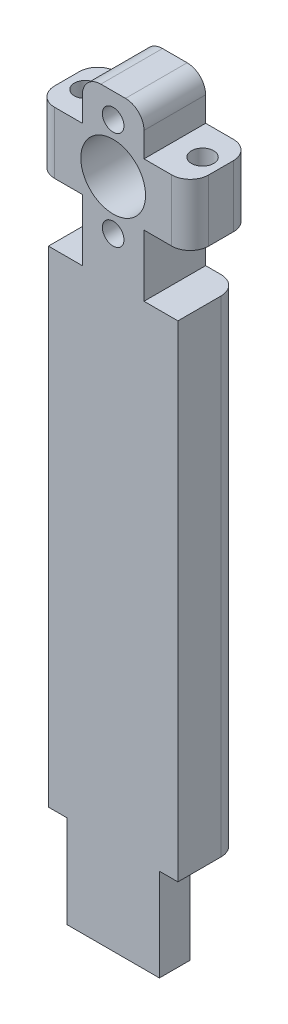
ISO-10303-21;
HEADER;
FILE_DESCRIPTION(('STEP AP214'),'2;1');
FILE_NAME('part.step','',(''),(''),'','','');
FILE_SCHEMA(('AUTOMOTIVE_DESIGN { 1 0 10303 214 1 1 1 1 }'));
ENDSEC;
DATA;
#1=APPLICATION_CONTEXT('core data for automotive mechanical design processes');
#2=APPLICATION_PROTOCOL_DEFINITION('international standard','automotive_design',2000,#1);
#3=PRODUCT_CONTEXT('',#1,'mechanical');
#4=PRODUCT('Part','Part','',(#3));
#5=PRODUCT_RELATED_PRODUCT_CATEGORY('part','',(#4));
#6=PRODUCT_DEFINITION_FORMATION('','',#4);
#7=PRODUCT_DEFINITION_CONTEXT('part definition',#1,'design');
#8=PRODUCT_DEFINITION('design','',#6,#7);
#9=PRODUCT_DEFINITION_SHAPE('','',#8);
#10=(LENGTH_UNIT() NAMED_UNIT(*) SI_UNIT(.MILLI.,.METRE.));
#11=(NAMED_UNIT(*) PLANE_ANGLE_UNIT() SI_UNIT($,.RADIAN.));
#12=(NAMED_UNIT(*) SI_UNIT($,.STERADIAN.) SOLID_ANGLE_UNIT());
#13=UNCERTAINTY_MEASURE_WITH_UNIT(LENGTH_MEASURE(1.E-05),#10,'distance_accuracy_value','');
#14=(GEOMETRIC_REPRESENTATION_CONTEXT(3) GLOBAL_UNCERTAINTY_ASSIGNED_CONTEXT((#13)) GLOBAL_UNIT_ASSIGNED_CONTEXT((#10,
#11,#12)) REPRESENTATION_CONTEXT('',''));
#15=CARTESIAN_POINT('',(0.,0.,0.));
#16=DIRECTION('',(0.,0.,1.));
#17=DIRECTION('',(1.,0.,0.));
#18=AXIS2_PLACEMENT_3D('',#15,#16,#17);
#19=CARTESIAN_POINT('',(-7.5,-108.8,0.));
#20=DIRECTION('',(1.,0.,0.));
#21=DIRECTION('',(0.,0.,-1.));
#22=AXIS2_PLACEMENT_3D('',#19,#20,#21);
#23=PLANE('',#22);
#24=DIRECTION('',(0.,1.,0.));
#25=VECTOR('',#24,1.);
#26=CARTESIAN_POINT('',(-7.5,-108.8,5.));
#27=LINE('',#26,#25);
#28=CARTESIAN_POINT('',(-7.5,-108.8,5.));
#29=VERTEX_POINT('',#28);
#30=CARTESIAN_POINT('',(-7.5,-93.8,5.));
#31=VERTEX_POINT('',#30);
#32=EDGE_CURVE('E225',#29,#31,#27,.T.);
#33=ORIENTED_EDGE('',*,*,#32,.F.);
#34=DIRECTION('',(0.,0.,-1.));
#35=VECTOR('',#34,1.);
#36=CARTESIAN_POINT('',(-7.5,-108.8,0.));
#37=LINE('',#36,#35);
#38=CARTESIAN_POINT('',(-7.5,-108.8,10.));
#39=VERTEX_POINT('',#38);
#40=EDGE_CURVE('E237',#39,#29,#37,.T.);
#41=ORIENTED_EDGE('',*,*,#40,.F.);
#42=DIRECTION('',(0.,1.,0.));
#43=VECTOR('',#42,1.);
#44=CARTESIAN_POINT('',(-7.5,-108.8,10.));
#45=LINE('',#44,#43);
#46=CARTESIAN_POINT('',(-7.5,-93.8,10.));
#47=VERTEX_POINT('',#46);
#48=EDGE_CURVE('E257',#39,#47,#45,.T.);
#49=ORIENTED_EDGE('',*,*,#48,.T.);
#50=DIRECTION('',(0.,0.,-1.));
#51=VECTOR('',#50,1.);
#52=CARTESIAN_POINT('',(-7.5,-93.8,0.));
#53=LINE('',#52,#51);
#54=EDGE_CURVE('E239',#47,#31,#53,.T.);
#55=ORIENTED_EDGE('',*,*,#54,.T.);
#56=EDGE_LOOP('',(#33,#41,#49,#55));
#57=FACE_BOUND('',#56,.T.);
#58=ADVANCED_FACE('F37',(#57),#23,.F.);
#59=CARTESIAN_POINT('',(7.5,-108.8,0.));
#60=DIRECTION('',(-1.,0.,0.));
#61=DIRECTION('',(0.,0.,1.));
#62=AXIS2_PLACEMENT_3D('',#59,#60,#61);
#63=PLANE('',#62);
#64=DIRECTION('',(0.,-1.,0.));
#65=VECTOR('',#64,1.);
#66=CARTESIAN_POINT('',(7.5,-93.8,5.));
#67=LINE('',#66,#65);
#68=CARTESIAN_POINT('',(7.5,-93.8,5.));
#69=VERTEX_POINT('',#68);
#70=CARTESIAN_POINT('',(7.5,-108.8,5.));
#71=VERTEX_POINT('',#70);
#72=EDGE_CURVE('E228',#69,#71,#67,.T.);
#73=ORIENTED_EDGE('',*,*,#72,.F.);
#74=DIRECTION('',(0.,0.,1.));
#75=VECTOR('',#74,1.);
#76=CARTESIAN_POINT('',(7.5,-93.8,0.));
#77=LINE('',#76,#75);
#78=CARTESIAN_POINT('',(7.5,-93.8,10.));
#79=VERTEX_POINT('',#78);
#80=EDGE_CURVE('E404',#69,#79,#77,.T.);
#81=ORIENTED_EDGE('',*,*,#80,.T.);
#82=DIRECTION('',(0.,1.,0.));
#83=VECTOR('',#82,1.);
#84=CARTESIAN_POINT('',(7.5,-108.8,10.));
#85=LINE('',#84,#83);
#86=CARTESIAN_POINT('',(7.5,-108.8,10.));
#87=VERTEX_POINT('',#86);
#88=EDGE_CURVE('E262',#87,#79,#85,.T.);
#89=ORIENTED_EDGE('',*,*,#88,.F.);
#90=DIRECTION('',(0.,0.,1.));
#91=VECTOR('',#90,1.);
#92=CARTESIAN_POINT('',(7.5,-108.8,0.));
#93=LINE('',#92,#91);
#94=EDGE_CURVE('E246',#71,#87,#93,.T.);
#95=ORIENTED_EDGE('',*,*,#94,.F.);
#96=EDGE_LOOP('',(#73,#81,#89,#95));
#97=FACE_BOUND('',#96,.T.);
#98=ADVANCED_FACE('F523',(#97),#63,.F.);
#99=CARTESIAN_POINT('',(0.,-108.8,0.));
#100=DIRECTION('',(0.,1.,0.));
#101=DIRECTION('',(0.,0.,1.));
#102=AXIS2_PLACEMENT_3D('',#99,#100,#101);
#103=PLANE('',#102);
#104=DIRECTION('',(-1.,0.,0.));
#105=VECTOR('',#104,1.);
#106=CARTESIAN_POINT('',(7.5,-108.8,5.));
#107=LINE('',#106,#105);
#108=EDGE_CURVE('E222',#71,#29,#107,.T.);
#109=ORIENTED_EDGE('',*,*,#108,.F.);
#110=ORIENTED_EDGE('',*,*,#94,.T.);
#111=DIRECTION('',(-1.,0.,0.));
#112=VECTOR('',#111,1.);
#113=CARTESIAN_POINT('',(-7.5,-108.8,10.));
#114=LINE('',#113,#112);
#115=EDGE_CURVE('E244',#87,#39,#114,.T.);
#116=ORIENTED_EDGE('',*,*,#115,.T.);
#117=ORIENTED_EDGE('',*,*,#40,.T.);
#118=EDGE_LOOP('',(#109,#110,#116,#117));
#119=FACE_BOUND('',#118,.T.);
#120=ADVANCED_FACE('F242',(#119),#103,.F.);
#121=CARTESIAN_POINT('',(-12.5,0.,10.));
#122=DIRECTION('',(1.,0.,0.));
#123=DIRECTION('',(0.,0.,-1.));
#124=AXIS2_PLACEMENT_3D('',#121,#122,#123);
#125=PLANE('',#124);
#126=DIRECTION('',(0.,0.,-1.));
#127=VECTOR('',#126,1.);
#128=CARTESIAN_POINT('',(-12.5,-5.,10.));
#129=LINE('',#128,#127);
#130=CARTESIAN_POINT('',(-12.5,-5.,7.));
#131=VERTEX_POINT('',#130);
#132=CARTESIAN_POINT('',(-12.5,-5.,3.));
#133=VERTEX_POINT('',#132);
#134=EDGE_CURVE('E365',#131,#133,#129,.T.);
#135=ORIENTED_EDGE('',*,*,#134,.F.);
#136=DIRECTION('',(0.,-1.,0.));
#137=VECTOR('',#136,1.);
#138=CARTESIAN_POINT('',(-12.5,5.,7.));
#139=LINE('',#138,#137);
#140=CARTESIAN_POINT('',(-12.5,5.,7.));
#141=VERTEX_POINT('',#140);
#142=EDGE_CURVE('E398',#131,#141,#139,.F.);
#143=ORIENTED_EDGE('',*,*,#142,.T.);
#144=DIRECTION('',(0.,0.,-1.));
#145=VECTOR('',#144,1.);
#146=CARTESIAN_POINT('',(-12.5,5.,10.));
#147=LINE('',#146,#145);
#148=CARTESIAN_POINT('',(-12.5,5.,3.));
#149=VERTEX_POINT('',#148);
#150=EDGE_CURVE('E319',#141,#149,#147,.T.);
#151=ORIENTED_EDGE('',*,*,#150,.T.);
#152=DIRECTION('',(0.,-1.,0.));
#153=VECTOR('',#152,1.);
#154=CARTESIAN_POINT('',(-12.5,0.,3.));
#155=LINE('',#154,#153);
#156=EDGE_CURVE('E395',#149,#133,#155,.T.);
#157=ORIENTED_EDGE('',*,*,#156,.T.);
#158=EDGE_LOOP('',(#135,#143,#151,#157));
#159=FACE_BOUND('',#158,.T.);
#160=ADVANCED_FACE('F565',(#159),#125,.F.);
#161=CARTESIAN_POINT('',(0.,-5.,10.));
#162=DIRECTION('',(0.,1.,0.));
#163=DIRECTION('',(0.,0.,1.));
#164=AXIS2_PLACEMENT_3D('',#161,#162,#163);
#165=PLANE('',#164);
#166=CARTESIAN_POINT('',(-9.5,-5.,4.99999999999773));
#167=DIRECTION('',(0.,-1.,0.));
#168=DIRECTION('',(0.,0.,-1.));
#169=AXIS2_PLACEMENT_3D('',#166,#167,#168);
#170=CIRCLE('',#169,1.8);
#171=CARTESIAN_POINT('',(-9.5,-5.,3.19999999999773));
#172=VERTEX_POINT('',#171);
#173=EDGE_CURVE('E284',#172,#172,#170,.T.);
#174=ORIENTED_EDGE('',*,*,#173,.F.);
#175=EDGE_LOOP('',(#174));
#176=FACE_BOUND('',#175,.T.);
#177=DIRECTION('',(1.,0.,0.));
#178=VECTOR('',#177,1.);
#179=CARTESIAN_POINT('',(0.,-5.,10.));
#180=LINE('',#179,#178);
#181=CARTESIAN_POINT('',(-9.5,-5.,10.));
#182=VERTEX_POINT('',#181);
#183=CARTESIAN_POINT('',(-5.,-5.,10.));
#184=VERTEX_POINT('',#183);
#185=EDGE_CURVE('E296',#182,#184,#180,.T.);
#186=ORIENTED_EDGE('',*,*,#185,.F.);
#187=CARTESIAN_POINT('',(-9.5,-5.,7.));
#188=DIRECTION('',(0.,1.,0.));
#189=DIRECTION('',(0.,0.,1.));
#190=AXIS2_PLACEMENT_3D('',#187,#188,#189);
#191=CIRCLE('',#190,3.);
#192=EDGE_CURVE('E393',#182,#131,#191,.F.);
#193=ORIENTED_EDGE('',*,*,#192,.T.);
#194=ORIENTED_EDGE('',*,*,#134,.T.);
#195=CARTESIAN_POINT('',(-9.5,-5.,3.));
#196=DIRECTION('',(0.,1.,0.));
#197=DIRECTION('',(0.,0.,1.));
#198=AXIS2_PLACEMENT_3D('',#195,#196,#197);
#199=CIRCLE('',#198,3.);
#200=CARTESIAN_POINT('',(-9.5,-5.,0.));
#201=VERTEX_POINT('',#200);
#202=EDGE_CURVE('E391',#133,#201,#199,.F.);
#203=ORIENTED_EDGE('',*,*,#202,.T.);
#204=DIRECTION('',(1.,0.,0.));
#205=VECTOR('',#204,1.);
#206=CARTESIAN_POINT('',(0.,-5.,0.));
#207=LINE('',#206,#205);
#208=CARTESIAN_POINT('',(-5.,-5.,0.));
#209=VERTEX_POINT('',#208);
#210=EDGE_CURVE('E287',#201,#209,#207,.T.);
#211=ORIENTED_EDGE('',*,*,#210,.T.);
#212=DIRECTION('',(0.,0.,-1.));
#213=VECTOR('',#212,1.);
#214=CARTESIAN_POINT('',(-5.,-5.,10.));
#215=LINE('',#214,#213);
#216=EDGE_CURVE('E362',#184,#209,#215,.T.);
#217=ORIENTED_EDGE('',*,*,#216,.F.);
#218=EDGE_LOOP('',(#186,#193,#194,#203,#211,#217));
#219=FACE_BOUND('',#218,.T.);
#220=ADVANCED_FACE('F571',(#176,#219),#165,.F.);
#221=CARTESIAN_POINT('',(-5.,0.,10.));
#222=DIRECTION('',(-1.,0.,0.));
#223=DIRECTION('',(0.,0.,1.));
#224=AXIS2_PLACEMENT_3D('',#221,#222,#223);
#225=PLANE('',#224);
#226=DIRECTION('',(0.,1.,0.));
#227=VECTOR('',#226,1.);
#228=CARTESIAN_POINT('',(-5.,0.,0.));
#229=LINE('',#228,#227);
#230=CARTESIAN_POINT('',(-5.,-15.,0.));
#231=VERTEX_POINT('',#230);
#232=EDGE_CURVE('E321',#231,#209,#229,.T.);
#233=ORIENTED_EDGE('',*,*,#232,.F.);
#234=DIRECTION('',(0.,0.,-1.));
#235=VECTOR('',#234,1.);
#236=CARTESIAN_POINT('',(-5.,-15.,10.));
#237=LINE('',#236,#235);
#238=CARTESIAN_POINT('',(-5.,-15.,10.));
#239=VERTEX_POINT('',#238);
#240=EDGE_CURVE('E359',#239,#231,#237,.T.);
#241=ORIENTED_EDGE('',*,*,#240,.F.);
#242=DIRECTION('',(0.,1.,0.));
#243=VECTOR('',#242,1.);
#244=CARTESIAN_POINT('',(-5.,0.,10.));
#245=LINE('',#244,#243);
#246=EDGE_CURVE('E298',#239,#184,#245,.T.);
#247=ORIENTED_EDGE('',*,*,#246,.T.);
#248=ORIENTED_EDGE('',*,*,#216,.T.);
#249=EDGE_LOOP('',(#233,#241,#247,#248));
#250=FACE_BOUND('',#249,.T.);
#251=ADVANCED_FACE('F549',(#250),#225,.T.);
#252=CARTESIAN_POINT('',(5.,0.,10.));
#253=DIRECTION('',(-1.,0.,0.));
#254=DIRECTION('',(0.,0.,1.));
#255=AXIS2_PLACEMENT_3D('',#252,#253,#254);
#256=PLANE('',#255);
#257=DIRECTION('',(0.,1.,0.));
#258=VECTOR('',#257,1.);
#259=CARTESIAN_POINT('',(5.,0.,0.));
#260=LINE('',#259,#258);
#261=CARTESIAN_POINT('',(5.,-15.,0.));
#262=VERTEX_POINT('',#261);
#263=CARTESIAN_POINT('',(5.,-5.,0.));
#264=VERTEX_POINT('',#263);
#265=EDGE_CURVE('E324',#262,#264,#260,.T.);
#266=ORIENTED_EDGE('',*,*,#265,.T.);
#267=DIRECTION('',(0.,0.,-1.));
#268=VECTOR('',#267,1.);
#269=CARTESIAN_POINT('',(5.,-5.,10.));
#270=LINE('',#269,#268);
#271=CARTESIAN_POINT('',(5.,-5.,10.));
#272=VERTEX_POINT('',#271);
#273=EDGE_CURVE('E354',#272,#264,#270,.T.);
#274=ORIENTED_EDGE('',*,*,#273,.F.);
#275=DIRECTION('',(0.,1.,0.));
#276=VECTOR('',#275,1.);
#277=CARTESIAN_POINT('',(5.,0.,10.));
#278=LINE('',#277,#276);
#279=CARTESIAN_POINT('',(5.,-15.,10.));
#280=VERTEX_POINT('',#279);
#281=EDGE_CURVE('E302',#280,#272,#278,.T.);
#282=ORIENTED_EDGE('',*,*,#281,.F.);
#283=DIRECTION('',(0.,0.,-1.));
#284=VECTOR('',#283,1.);
#285=CARTESIAN_POINT('',(5.,-15.,10.));
#286=LINE('',#285,#284);
#287=EDGE_CURVE('E357',#280,#262,#286,.T.);
#288=ORIENTED_EDGE('',*,*,#287,.T.);
#289=EDGE_LOOP('',(#266,#274,#282,#288));
#290=FACE_BOUND('',#289,.T.);
#291=ADVANCED_FACE('F485',(#290),#256,.F.);
#292=CARTESIAN_POINT('',(0.,-5.,10.));
#293=DIRECTION('',(0.,1.,0.));
#294=DIRECTION('',(0.,0.,1.));
#295=AXIS2_PLACEMENT_3D('',#292,#293,#294);
#296=PLANE('',#295);
#297=CARTESIAN_POINT('',(9.5,-5.,4.99999999999773));
#298=DIRECTION('',(0.,-1.,0.));
#299=DIRECTION('',(0.,0.,1.));
#300=AXIS2_PLACEMENT_3D('',#297,#298,#299);
#301=CIRCLE('',#300,1.8);
#302=CARTESIAN_POINT('',(9.5,-5.,6.79999999999773));
#303=VERTEX_POINT('',#302);
#304=EDGE_CURVE('E291',#303,#303,#301,.T.);
#305=ORIENTED_EDGE('',*,*,#304,.F.);
#306=EDGE_LOOP('',(#305));
#307=FACE_BOUND('',#306,.T.);
#308=DIRECTION('',(1.,0.,0.));
#309=VECTOR('',#308,1.);
#310=CARTESIAN_POINT('',(0.,-5.,0.));
#311=LINE('',#310,#309);
#312=CARTESIAN_POINT('',(9.50000000000001,-5.,0.));
#313=VERTEX_POINT('',#312);
#314=EDGE_CURVE('E326',#264,#313,#311,.T.);
#315=ORIENTED_EDGE('',*,*,#314,.T.);
#316=CARTESIAN_POINT('',(9.50000000000001,-5.,3.));
#317=DIRECTION('',(0.,1.,0.));
#318=DIRECTION('',(0.,0.,1.));
#319=AXIS2_PLACEMENT_3D('',#316,#317,#318);
#320=CIRCLE('',#319,3.);
#321=CARTESIAN_POINT('',(12.5,-5.,3.));
#322=VERTEX_POINT('',#321);
#323=EDGE_CURVE('E375',#313,#322,#320,.F.);
#324=ORIENTED_EDGE('',*,*,#323,.T.);
#325=DIRECTION('',(0.,0.,-1.));
#326=VECTOR('',#325,1.);
#327=CARTESIAN_POINT('',(12.5,-5.,10.));
#328=LINE('',#327,#326);
#329=CARTESIAN_POINT('',(12.5,-5.,7.));
#330=VERTEX_POINT('',#329);
#331=EDGE_CURVE('E351',#330,#322,#328,.T.);
#332=ORIENTED_EDGE('',*,*,#331,.F.);
#333=CARTESIAN_POINT('',(9.50000000000001,-5.,7.));
#334=DIRECTION('',(0.,1.,0.));
#335=DIRECTION('',(0.,0.,1.));
#336=AXIS2_PLACEMENT_3D('',#333,#334,#335);
#337=CIRCLE('',#336,3.);
#338=CARTESIAN_POINT('',(9.50000000000001,-5.,10.));
#339=VERTEX_POINT('',#338);
#340=EDGE_CURVE('E373',#330,#339,#337,.F.);
#341=ORIENTED_EDGE('',*,*,#340,.T.);
#342=DIRECTION('',(1.,0.,0.));
#343=VECTOR('',#342,1.);
#344=CARTESIAN_POINT('',(0.,-5.,10.));
#345=LINE('',#344,#343);
#346=EDGE_CURVE('E304',#272,#339,#345,.T.);
#347=ORIENTED_EDGE('',*,*,#346,.F.);
#348=ORIENTED_EDGE('',*,*,#273,.T.);
#349=EDGE_LOOP('',(#315,#324,#332,#341,#347,#348));
#350=FACE_BOUND('',#349,.T.);
#351=ADVANCED_FACE('F472',(#307,#350),#296,.F.);
#352=CARTESIAN_POINT('',(12.5,0.,10.));
#353=DIRECTION('',(1.,0.,0.));
#354=DIRECTION('',(0.,1.,0.));
#355=AXIS2_PLACEMENT_3D('',#352,#353,#354);
#356=PLANE('',#355);
#357=ORIENTED_EDGE('',*,*,#331,.T.);
#358=DIRECTION('',(0.,-1.,0.));
#359=VECTOR('',#358,1.);
#360=CARTESIAN_POINT('',(12.5,5.,3.));
#361=LINE('',#360,#359);
#362=CARTESIAN_POINT('',(12.5,5.,3.));
#363=VERTEX_POINT('',#362);
#364=EDGE_CURVE('E380',#322,#363,#361,.F.);
#365=ORIENTED_EDGE('',*,*,#364,.T.);
#366=DIRECTION('',(0.,0.,-1.));
#367=VECTOR('',#366,1.);
#368=CARTESIAN_POINT('',(12.5,5.,10.));
#369=LINE('',#368,#367);
#370=CARTESIAN_POINT('',(12.5,5.,7.));
#371=VERTEX_POINT('',#370);
#372=EDGE_CURVE('E348',#371,#363,#369,.T.);
#373=ORIENTED_EDGE('',*,*,#372,.F.);
#374=DIRECTION('',(0.,-1.,0.));
#375=VECTOR('',#374,1.);
#376=CARTESIAN_POINT('',(12.5,0.,7.));
#377=LINE('',#376,#375);
#378=EDGE_CURVE('E377',#371,#330,#377,.T.);
#379=ORIENTED_EDGE('',*,*,#378,.T.);
#380=EDGE_LOOP('',(#357,#365,#373,#379));
#381=FACE_BOUND('',#380,.T.);
#382=ADVANCED_FACE('F474',(#381),#356,.T.);
#383=CARTESIAN_POINT('',(0.,5.,10.));
#384=DIRECTION('',(0.,1.,0.));
#385=DIRECTION('',(0.,0.,1.));
#386=AXIS2_PLACEMENT_3D('',#383,#384,#385);
#387=PLANE('',#386);
#388=CARTESIAN_POINT('',(9.5,5.,4.99999999999773));
#389=DIRECTION('',(0.,1.,0.));
#390=DIRECTION('',(0.,0.,1.));
#391=AXIS2_PLACEMENT_3D('',#388,#389,#390);
#392=CIRCLE('',#391,1.8);
#393=CARTESIAN_POINT('',(9.5,5.,6.79999999999773));
#394=VERTEX_POINT('',#393);
#395=EDGE_CURVE('E281',#394,#394,#392,.F.);
#396=ORIENTED_EDGE('',*,*,#395,.T.);
#397=EDGE_LOOP('',(#396));
#398=FACE_BOUND('',#397,.T.);
#399=ORIENTED_EDGE('',*,*,#372,.T.);
#400=CARTESIAN_POINT('',(9.5,5.,3.));
#401=DIRECTION('',(0.,1.,0.));
#402=DIRECTION('',(0.,0.,1.));
#403=AXIS2_PLACEMENT_3D('',#400,#401,#402);
#404=CIRCLE('',#403,3.);
#405=CARTESIAN_POINT('',(9.5,5.,0.));
#406=VERTEX_POINT('',#405);
#407=EDGE_CURVE('E384',#363,#406,#404,.T.);
#408=ORIENTED_EDGE('',*,*,#407,.T.);
#409=DIRECTION('',(1.,0.,0.));
#410=VECTOR('',#409,1.);
#411=CARTESIAN_POINT('',(0.,5.,0.));
#412=LINE('',#411,#410);
#413=CARTESIAN_POINT('',(5.,5.,0.));
#414=VERTEX_POINT('',#413);
#415=EDGE_CURVE('E329',#414,#406,#412,.T.);
#416=ORIENTED_EDGE('',*,*,#415,.F.);
#417=DIRECTION('',(0.,0.,-1.));
#418=VECTOR('',#417,1.);
#419=CARTESIAN_POINT('',(5.,5.,10.));
#420=LINE('',#419,#418);
#421=CARTESIAN_POINT('',(5.,5.,10.));
#422=VERTEX_POINT('',#421);
#423=EDGE_CURVE('E346',#422,#414,#420,.T.);
#424=ORIENTED_EDGE('',*,*,#423,.F.);
#425=DIRECTION('',(1.,0.,0.));
#426=VECTOR('',#425,1.);
#427=CARTESIAN_POINT('',(0.,5.,10.));
#428=LINE('',#427,#426);
#429=CARTESIAN_POINT('',(9.5,5.,10.));
#430=VERTEX_POINT('',#429);
#431=EDGE_CURVE('E307',#422,#430,#428,.T.);
#432=ORIENTED_EDGE('',*,*,#431,.T.);
#433=CARTESIAN_POINT('',(9.5,5.,7.));
#434=DIRECTION('',(0.,1.,0.));
#435=DIRECTION('',(0.,0.,1.));
#436=AXIS2_PLACEMENT_3D('',#433,#434,#435);
#437=CIRCLE('',#436,3.);
#438=EDGE_CURVE('E382',#430,#371,#437,.T.);
#439=ORIENTED_EDGE('',*,*,#438,.T.);
#440=EDGE_LOOP('',(#399,#408,#416,#424,#432,#439));
#441=FACE_BOUND('',#440,.T.);
#442=ADVANCED_FACE('F462',(#398,#441),#387,.T.);
#443=CARTESIAN_POINT('',(5.,0.,10.));
#444=DIRECTION('',(-1.,0.,0.));
#445=DIRECTION('',(0.,0.,1.));
#446=AXIS2_PLACEMENT_3D('',#443,#444,#445);
#447=PLANE('',#446);
#448=DIRECTION('',(0.,1.,0.));
#449=VECTOR('',#448,1.);
#450=CARTESIAN_POINT('',(5.,0.,0.));
#451=LINE('',#450,#449);
#452=CARTESIAN_POINT('',(5.,9.,0.));
#453=VERTEX_POINT('',#452);
#454=EDGE_CURVE('E332',#414,#453,#451,.T.);
#455=ORIENTED_EDGE('',*,*,#454,.T.);
#456=DIRECTION('',(0.,0.,-1.));
#457=VECTOR('',#456,1.);
#458=CARTESIAN_POINT('',(5.,9.,10.));
#459=LINE('',#458,#457);
#460=CARTESIAN_POINT('',(5.,9.,10.));
#461=VERTEX_POINT('',#460);
#462=EDGE_CURVE('E11',#453,#461,#459,.F.);
#463=ORIENTED_EDGE('',*,*,#462,.T.);
#464=DIRECTION('',(0.,1.,0.));
#465=VECTOR('',#464,1.);
#466=CARTESIAN_POINT('',(5.,0.,10.));
#467=LINE('',#466,#465);
#468=EDGE_CURVE('E310',#422,#461,#467,.T.);
#469=ORIENTED_EDGE('',*,*,#468,.F.);
#470=ORIENTED_EDGE('',*,*,#423,.T.);
#471=EDGE_LOOP('',(#455,#463,#469,#470));
#472=FACE_BOUND('',#471,.T.);
#473=ADVANCED_FACE('F459',(#472),#447,.F.);
#474=CARTESIAN_POINT('',(0.,12.,10.));
#475=DIRECTION('',(0.,1.,0.));
#476=DIRECTION('',(0.,0.,1.));
#477=AXIS2_PLACEMENT_3D('',#474,#475,#476);
#478=PLANE('',#477);
#479=DIRECTION('',(1.,0.,0.));
#480=VECTOR('',#479,1.);
#481=CARTESIAN_POINT('',(0.,12.,0.));
#482=LINE('',#481,#480);
#483=CARTESIAN_POINT('',(-2.,12.,0.));
#484=VERTEX_POINT('',#483);
#485=CARTESIAN_POINT('',(2.,12.,0.));
#486=VERTEX_POINT('',#485);
#487=EDGE_CURVE('E334',#484,#486,#482,.T.);
#488=ORIENTED_EDGE('',*,*,#487,.F.);
#489=DIRECTION('',(0.,0.,-1.));
#490=VECTOR('',#489,1.);
#491=CARTESIAN_POINT('',(-2.,12.,10.));
#492=LINE('',#491,#490);
#493=CARTESIAN_POINT('',(-2.,12.,10.));
#494=VERTEX_POINT('',#493);
#495=EDGE_CURVE('E435',#484,#494,#492,.F.);
#496=ORIENTED_EDGE('',*,*,#495,.T.);
#497=DIRECTION('',(1.,0.,0.));
#498=VECTOR('',#497,1.);
#499=CARTESIAN_POINT('',(0.,12.,10.));
#500=LINE('',#499,#498);
#501=CARTESIAN_POINT('',(2.,12.,10.));
#502=VERTEX_POINT('',#501);
#503=EDGE_CURVE('E312',#494,#502,#500,.T.);
#504=ORIENTED_EDGE('',*,*,#503,.T.);
#505=DIRECTION('',(0.,0.,-1.));
#506=VECTOR('',#505,1.);
#507=CARTESIAN_POINT('',(2.,12.,0.));
#508=LINE('',#507,#506);
#509=EDGE_CURVE('E432',#502,#486,#508,.T.);
#510=ORIENTED_EDGE('',*,*,#509,.T.);
#511=EDGE_LOOP('',(#488,#496,#504,#510));
#512=FACE_BOUND('',#511,.T.);
#513=ADVANCED_FACE('F454',(#512),#478,.T.);
#514=CARTESIAN_POINT('',(-5.,0.,10.));
#515=DIRECTION('',(-1.,0.,0.));
#516=DIRECTION('',(0.,0.,1.));
#517=AXIS2_PLACEMENT_3D('',#514,#515,#516);
#518=PLANE('',#517);
#519=DIRECTION('',(0.,1.,0.));
#520=VECTOR('',#519,1.);
#521=CARTESIAN_POINT('',(-5.,0.,10.));
#522=LINE('',#521,#520);
#523=CARTESIAN_POINT('',(-5.,5.,10.));
#524=VERTEX_POINT('',#523);
#525=CARTESIAN_POINT('',(-5.,9.,10.));
#526=VERTEX_POINT('',#525);
#527=EDGE_CURVE('E314',#524,#526,#522,.T.);
#528=ORIENTED_EDGE('',*,*,#527,.T.);
#529=DIRECTION('',(0.,0.,-1.));
#530=VECTOR('',#529,1.);
#531=CARTESIAN_POINT('',(-5.,9.,10.));
#532=LINE('',#531,#530);
#533=CARTESIAN_POINT('',(-5.,9.,0.));
#534=VERTEX_POINT('',#533);
#535=EDGE_CURVE('E425',#526,#534,#532,.T.);
#536=ORIENTED_EDGE('',*,*,#535,.T.);
#537=DIRECTION('',(0.,1.,0.));
#538=VECTOR('',#537,1.);
#539=CARTESIAN_POINT('',(-5.,0.,0.));
#540=LINE('',#539,#538);
#541=CARTESIAN_POINT('',(-5.,5.,0.));
#542=VERTEX_POINT('',#541);
#543=EDGE_CURVE('E337',#542,#534,#540,.T.);
#544=ORIENTED_EDGE('',*,*,#543,.F.);
#545=DIRECTION('',(0.,0.,-1.));
#546=VECTOR('',#545,1.);
#547=CARTESIAN_POINT('',(-5.,5.,10.));
#548=LINE('',#547,#546);
#549=EDGE_CURVE('E343',#524,#542,#548,.T.);
#550=ORIENTED_EDGE('',*,*,#549,.F.);
#551=EDGE_LOOP('',(#528,#536,#544,#550));
#552=FACE_BOUND('',#551,.T.);
#553=ADVANCED_FACE('F447',(#552),#518,.T.);
#554=CARTESIAN_POINT('',(0.,5.,10.));
#555=DIRECTION('',(0.,1.,0.));
#556=DIRECTION('',(0.,0.,1.));
#557=AXIS2_PLACEMENT_3D('',#554,#555,#556);
#558=PLANE('',#557);
#559=CARTESIAN_POINT('',(-9.5,5.,4.99999999999773));
#560=DIRECTION('',(0.,1.,0.));
#561=DIRECTION('',(0.,0.,1.));
#562=AXIS2_PLACEMENT_3D('',#559,#560,#561);
#563=CIRCLE('',#562,1.8);
#564=CARTESIAN_POINT('',(-9.5,5.,6.79999999999773));
#565=VERTEX_POINT('',#564);
#566=EDGE_CURVE('E288',#565,#565,#563,.F.);
#567=ORIENTED_EDGE('',*,*,#566,.T.);
#568=EDGE_LOOP('',(#567));
#569=FACE_BOUND('',#568,.T.);
#570=ORIENTED_EDGE('',*,*,#150,.F.);
#571=CARTESIAN_POINT('',(-9.5,5.,7.));
#572=DIRECTION('',(0.,1.,0.));
#573=DIRECTION('',(0.,0.,1.));
#574=AXIS2_PLACEMENT_3D('',#571,#572,#573);
#575=CIRCLE('',#574,3.);
#576=CARTESIAN_POINT('',(-9.5,5.,10.));
#577=VERTEX_POINT('',#576);
#578=EDGE_CURVE('E402',#141,#577,#575,.T.);
#579=ORIENTED_EDGE('',*,*,#578,.T.);
#580=DIRECTION('',(1.,0.,0.));
#581=VECTOR('',#580,1.);
#582=CARTESIAN_POINT('',(0.,5.,10.));
#583=LINE('',#582,#581);
#584=EDGE_CURVE('E317',#577,#524,#583,.T.);
#585=ORIENTED_EDGE('',*,*,#584,.T.);
#586=ORIENTED_EDGE('',*,*,#549,.T.);
#587=DIRECTION('',(1.,0.,0.));
#588=VECTOR('',#587,1.);
#589=CARTESIAN_POINT('',(0.,5.,0.));
#590=LINE('',#589,#588);
#591=CARTESIAN_POINT('',(-9.5,5.,0.));
#592=VERTEX_POINT('',#591);
#593=EDGE_CURVE('E299',#592,#542,#590,.T.);
#594=ORIENTED_EDGE('',*,*,#593,.F.);
#595=CARTESIAN_POINT('',(-9.5,5.,3.));
#596=DIRECTION('',(0.,1.,0.));
#597=DIRECTION('',(0.,0.,1.));
#598=AXIS2_PLACEMENT_3D('',#595,#596,#597);
#599=CIRCLE('',#598,3.);
#600=EDGE_CURVE('E400',#592,#149,#599,.T.);
#601=ORIENTED_EDGE('',*,*,#600,.T.);
#602=EDGE_LOOP('',(#570,#579,#585,#586,#594,#601));
#603=FACE_BOUND('',#602,.T.);
#604=ADVANCED_FACE('F561',(#569,#603),#558,.T.);
#605=CARTESIAN_POINT('',(0.,0.,10.));
#606=DIRECTION('',(0.,0.,1.));
#607=DIRECTION('',(1.,0.,0.));
#608=AXIS2_PLACEMENT_3D('',#605,#606,#607);
#609=PLANE('',#608);
#610=ORIENTED_EDGE('',*,*,#503,.F.);
#611=CARTESIAN_POINT('',(-2.,9.,10.));
#612=DIRECTION('',(0.,0.,1.));
#613=DIRECTION('',(1.,0.,0.));
#614=AXIS2_PLACEMENT_3D('',#611,#612,#613);
#615=CIRCLE('',#614,3.);
#616=EDGE_CURVE('E45',#494,#526,#615,.T.);
#617=ORIENTED_EDGE('',*,*,#616,.T.);
#618=ORIENTED_EDGE('',*,*,#527,.F.);
#619=ORIENTED_EDGE('',*,*,#584,.F.);
#620=DIRECTION('',(0.,-1.,0.));
#621=VECTOR('',#620,1.);
#622=CARTESIAN_POINT('',(-9.5,-5.,10.));
#623=LINE('',#622,#621);
#624=EDGE_CURVE('E386',#577,#182,#623,.T.);
#625=ORIENTED_EDGE('',*,*,#624,.T.);
#626=ORIENTED_EDGE('',*,*,#185,.T.);
#627=ORIENTED_EDGE('',*,*,#246,.F.);
#628=DIRECTION('',(-1.,0.,0.));
#629=VECTOR('',#628,1.);
#630=CARTESIAN_POINT('',(-7.5,-15.,10.));
#631=LINE('',#630,#629);
#632=CARTESIAN_POINT('',(-10.5,-15.,9.99999999999999));
#633=VERTEX_POINT('',#632);
#634=EDGE_CURVE('E251',#239,#633,#631,.T.);
#635=ORIENTED_EDGE('',*,*,#634,.T.);
#636=DIRECTION('',(0.,1.,0.));
#637=VECTOR('',#636,1.);
#638=CARTESIAN_POINT('',(-10.5,-93.8,9.99999999999999));
#639=LINE('',#638,#637);
#640=CARTESIAN_POINT('',(-10.5,-93.8,9.99999999999999));
#641=VERTEX_POINT('',#640);
#642=EDGE_CURVE('E507',#641,#633,#639,.T.);
#643=ORIENTED_EDGE('',*,*,#642,.F.);
#644=DIRECTION('',(-1.,0.,0.));
#645=VECTOR('',#644,1.);
#646=CARTESIAN_POINT('',(10.5,-93.8,9.99999999999999));
#647=LINE('',#646,#645);
#648=EDGE_CURVE('E517',#47,#641,#647,.T.);
#649=ORIENTED_EDGE('',*,*,#648,.F.);
#650=ORIENTED_EDGE('',*,*,#48,.F.);
#651=ORIENTED_EDGE('',*,*,#115,.F.);
#652=ORIENTED_EDGE('',*,*,#88,.T.);
#653=CARTESIAN_POINT('',(10.5,-93.8,9.99999999999999));
#654=VERTEX_POINT('',#653);
#655=EDGE_CURVE('E508',#654,#79,#647,.T.);
#656=ORIENTED_EDGE('',*,*,#655,.F.);
#657=DIRECTION('',(0.,-1.,0.));
#658=VECTOR('',#657,1.);
#659=CARTESIAN_POINT('',(10.5,-93.8,9.99999999999999));
#660=LINE('',#659,#658);
#661=CARTESIAN_POINT('',(10.5,-15.,9.99999999999999));
#662=VERTEX_POINT('',#661);
#663=EDGE_CURVE('E496',#662,#654,#660,.T.);
#664=ORIENTED_EDGE('',*,*,#663,.F.);
#665=EDGE_CURVE('E247',#662,#280,#631,.T.);
#666=ORIENTED_EDGE('',*,*,#665,.T.);
#667=ORIENTED_EDGE('',*,*,#281,.T.);
#668=ORIENTED_EDGE('',*,*,#346,.T.);
#669=DIRECTION('',(0.,-1.,0.));
#670=VECTOR('',#669,1.);
#671=CARTESIAN_POINT('',(9.50000000000001,0.,10.));
#672=LINE('',#671,#670);
#673=EDGE_CURVE('E389',#339,#430,#672,.F.);
#674=ORIENTED_EDGE('',*,*,#673,.T.);
#675=ORIENTED_EDGE('',*,*,#431,.F.);
#676=ORIENTED_EDGE('',*,*,#468,.T.);
#677=CARTESIAN_POINT('',(2.,9.,10.));
#678=DIRECTION('',(0.,0.,1.));
#679=DIRECTION('',(1.,0.,0.));
#680=AXIS2_PLACEMENT_3D('',#677,#678,#679);
#681=CIRCLE('',#680,3.);
#682=EDGE_CURVE('E57',#461,#502,#681,.T.);
#683=ORIENTED_EDGE('',*,*,#682,.T.);
#684=EDGE_LOOP('',(#610,#617,#618,#619,#625,#626,#627,#635,#643,#649,#650,#651,#652,#656,#664,
#666,#667,#668,#674,#675,#676,#683));
#685=FACE_BOUND('',#684,.T.);
#686=CARTESIAN_POINT('',(0.,8.,10.));
#687=DIRECTION('',(0.,0.,1.));
#688=DIRECTION('',(1.,0.,0.));
#689=AXIS2_PLACEMENT_3D('',#686,#687,#688);
#690=CIRCLE('',#689,1.75);
#691=CARTESIAN_POINT('',(1.75,8.,10.));
#692=VERTEX_POINT('',#691);
#693=EDGE_CURVE('E266',#692,#692,#690,.T.);
#694=ORIENTED_EDGE('',*,*,#693,.F.);
#695=EDGE_LOOP('',(#694));
#696=FACE_BOUND('',#695,.T.);
#697=CARTESIAN_POINT('',(0.,-8.,10.));
#698=DIRECTION('',(0.,0.,1.));
#699=DIRECTION('',(1.,0.,0.));
#700=AXIS2_PLACEMENT_3D('',#697,#698,#699);
#701=CIRCLE('',#700,1.75);
#702=CARTESIAN_POINT('',(1.75,-8.,10.));
#703=VERTEX_POINT('',#702);
#704=EDGE_CURVE('E265',#703,#703,#701,.T.);
#705=ORIENTED_EDGE('',*,*,#704,.F.);
#706=EDGE_LOOP('',(#705));
#707=FACE_BOUND('',#706,.T.);
#708=CARTESIAN_POINT('',(0.,0.,10.));
#709=DIRECTION('',(0.,0.,1.));
#710=DIRECTION('',(1.,0.,0.));
#711=AXIS2_PLACEMENT_3D('',#708,#709,#710);
#712=CIRCLE('',#711,5.25);
#713=CARTESIAN_POINT('',(5.25,0.,10.));
#714=VERTEX_POINT('',#713);
#715=EDGE_CURVE('E273',#714,#714,#712,.F.);
#716=ORIENTED_EDGE('',*,*,#715,.T.);
#717=EDGE_LOOP('',(#716));
#718=FACE_BOUND('',#717,.T.);
#719=ADVANCED_FACE('F439',(#685,#696,#707,#718),#609,.T.);
#720=CARTESIAN_POINT('',(0.,0.,0.));
#721=DIRECTION('',(0.,0.,1.));
#722=DIRECTION('',(1.,0.,0.));
#723=AXIS2_PLACEMENT_3D('',#720,#721,#722);
#724=PLANE('',#723);
#725=CARTESIAN_POINT('',(0.,8.,0.));
#726=DIRECTION('',(0.,0.,1.));
#727=DIRECTION('',(1.,0.,0.));
#728=AXIS2_PLACEMENT_3D('',#725,#726,#727);
#729=CIRCLE('',#728,1.75);
#730=CARTESIAN_POINT('',(1.75,8.,0.));
#731=VERTEX_POINT('',#730);
#732=EDGE_CURVE('E269',#731,#731,#729,.F.);
#733=ORIENTED_EDGE('',*,*,#732,.F.);
#734=EDGE_LOOP('',(#733));
#735=FACE_BOUND('',#734,.T.);
#736=CARTESIAN_POINT('',(0.,-8.,0.));
#737=DIRECTION('',(0.,0.,1.));
#738=DIRECTION('',(1.,0.,0.));
#739=AXIS2_PLACEMENT_3D('',#736,#737,#738);
#740=CIRCLE('',#739,1.75);
#741=CARTESIAN_POINT('',(1.75,-8.,0.));
#742=VERTEX_POINT('',#741);
#743=EDGE_CURVE('E270',#742,#742,#740,.F.);
#744=ORIENTED_EDGE('',*,*,#743,.F.);
#745=EDGE_LOOP('',(#744));
#746=FACE_BOUND('',#745,.T.);
#747=CARTESIAN_POINT('',(0.,0.,0.));
#748=DIRECTION('',(0.,0.,-1.));
#749=DIRECTION('',(-1.,0.,0.));
#750=AXIS2_PLACEMENT_3D('',#747,#748,#749);
#751=CIRCLE('',#750,5.25);
#752=CARTESIAN_POINT('',(-5.25,0.,0.));
#753=VERTEX_POINT('',#752);
#754=EDGE_CURVE('E278',#753,#753,#751,.T.);
#755=ORIENTED_EDGE('',*,*,#754,.F.);
#756=EDGE_LOOP('',(#755));
#757=FACE_BOUND('',#756,.T.);
#758=ORIENTED_EDGE('',*,*,#543,.T.);
#759=CARTESIAN_POINT('',(-2.,9.,0.));
#760=DIRECTION('',(0.,0.,1.));
#761=DIRECTION('',(1.,0.,0.));
#762=AXIS2_PLACEMENT_3D('',#759,#760,#761);
#763=CIRCLE('',#762,3.);
#764=EDGE_CURVE('E430',#534,#484,#763,.F.);
#765=ORIENTED_EDGE('',*,*,#764,.T.);
#766=ORIENTED_EDGE('',*,*,#487,.T.);
#767=CARTESIAN_POINT('',(2.,9.,0.));
#768=DIRECTION('',(0.,0.,1.));
#769=DIRECTION('',(1.,0.,0.));
#770=AXIS2_PLACEMENT_3D('',#767,#768,#769);
#771=CIRCLE('',#770,3.);
#772=EDGE_CURVE('E428',#486,#453,#771,.F.);
#773=ORIENTED_EDGE('',*,*,#772,.T.);
#774=ORIENTED_EDGE('',*,*,#454,.F.);
#775=ORIENTED_EDGE('',*,*,#415,.T.);
#776=DIRECTION('',(0.,-1.,0.));
#777=VECTOR('',#776,1.);
#778=CARTESIAN_POINT('',(9.50000000000001,-5.,0.));
#779=LINE('',#778,#777);
#780=EDGE_CURVE('E370',#406,#313,#779,.T.);
#781=ORIENTED_EDGE('',*,*,#780,.T.);
#782=ORIENTED_EDGE('',*,*,#314,.F.);
#783=ORIENTED_EDGE('',*,*,#265,.F.);
#784=DIRECTION('',(1.,0.,0.));
#785=VECTOR('',#784,1.);
#786=CARTESIAN_POINT('',(-7.5,-15.,0.));
#787=LINE('',#786,#785);
#788=CARTESIAN_POINT('',(7.5,-15.,0.));
#789=VERTEX_POINT('',#788);
#790=EDGE_CURVE('E259',#262,#789,#787,.T.);
#791=ORIENTED_EDGE('',*,*,#790,.T.);
#792=DIRECTION('',(0.,-1.,0.));
#793=VECTOR('',#792,1.);
#794=CARTESIAN_POINT('',(7.5,-93.8,0.));
#795=LINE('',#794,#793);
#796=CARTESIAN_POINT('',(7.5,-93.8,0.));
#797=VERTEX_POINT('',#796);
#798=EDGE_CURVE('E406',#789,#797,#795,.T.);
#799=ORIENTED_EDGE('',*,*,#798,.T.);
#800=DIRECTION('',(1.,0.,0.));
#801=VECTOR('',#800,1.);
#802=CARTESIAN_POINT('',(-7.5,-93.8,0.));
#803=LINE('',#802,#801);
#804=CARTESIAN_POINT('',(-7.5,-93.8,0.));
#805=VERTEX_POINT('',#804);
#806=EDGE_CURVE('E232',#805,#797,#803,.T.);
#807=ORIENTED_EDGE('',*,*,#806,.F.);
#808=DIRECTION('',(0.,1.,0.));
#809=VECTOR('',#808,1.);
#810=CARTESIAN_POINT('',(-7.5,-15.,0.));
#811=LINE('',#810,#809);
#812=CARTESIAN_POINT('',(-7.5,-15.,0.));
#813=VERTEX_POINT('',#812);
#814=EDGE_CURVE('E409',#805,#813,#811,.T.);
#815=ORIENTED_EDGE('',*,*,#814,.T.);
#816=EDGE_CURVE('E258',#813,#231,#787,.T.);
#817=ORIENTED_EDGE('',*,*,#816,.T.);
#818=ORIENTED_EDGE('',*,*,#232,.T.);
#819=ORIENTED_EDGE('',*,*,#210,.F.);
#820=DIRECTION('',(0.,-1.,0.));
#821=VECTOR('',#820,1.);
#822=CARTESIAN_POINT('',(-9.5,0.,0.));
#823=LINE('',#822,#821);
#824=EDGE_CURVE('E368',#201,#592,#823,.F.);
#825=ORIENTED_EDGE('',*,*,#824,.T.);
#826=ORIENTED_EDGE('',*,*,#593,.T.);
#827=EDGE_LOOP('',(#758,#765,#766,#773,#774,#775,#781,#782,#783,#791,#799,#807,#815,#817,#818,
#819,#825,#826));
#828=FACE_BOUND('',#827,.T.);
#829=ADVANCED_FACE('F452',(#735,#746,#757,#828),#724,.F.);
#830=CARTESIAN_POINT('',(-9.5,12.001,4.99999999999773));
#831=DIRECTION('',(0.,-1.,0.));
#832=DIRECTION('',(0.,0.,-1.));
#833=AXIS2_PLACEMENT_3D('',#830,#831,#832);
#834=CYLINDRICAL_SURFACE('',#833,1.8);
#835=ORIENTED_EDGE('',*,*,#566,.F.);
#836=EDGE_LOOP('',(#835));
#837=FACE_BOUND('',#836,.T.);
#838=ORIENTED_EDGE('',*,*,#173,.T.);
#839=EDGE_LOOP('',(#838));
#840=FACE_BOUND('',#839,.T.);
#841=ADVANCED_FACE('F603',(#837,#840),#834,.F.);
#842=CARTESIAN_POINT('',(9.5,12.001,4.99999999999773));
#843=DIRECTION('',(0.,-1.,0.));
#844=DIRECTION('',(0.,0.,-1.));
#845=AXIS2_PLACEMENT_3D('',#842,#843,#844);
#846=CYLINDRICAL_SURFACE('',#845,1.8);
#847=ORIENTED_EDGE('',*,*,#395,.F.);
#848=EDGE_LOOP('',(#847));
#849=FACE_BOUND('',#848,.T.);
#850=ORIENTED_EDGE('',*,*,#304,.T.);
#851=EDGE_LOOP('',(#850));
#852=FACE_BOUND('',#851,.T.);
#853=ADVANCED_FACE('F601',(#849,#852),#846,.F.);
#854=CARTESIAN_POINT('',(0.,0.,10.001));
#855=DIRECTION('',(0.,0.,-1.));
#856=DIRECTION('',(-1.,0.,0.));
#857=AXIS2_PLACEMENT_3D('',#854,#855,#856);
#858=CYLINDRICAL_SURFACE('',#857,5.25);
#859=ORIENTED_EDGE('',*,*,#715,.F.);
#860=EDGE_LOOP('',(#859));
#861=FACE_BOUND('',#860,.T.);
#862=ORIENTED_EDGE('',*,*,#754,.T.);
#863=EDGE_LOOP('',(#862));
#864=FACE_BOUND('',#863,.T.);
#865=ADVANCED_FACE('F598',(#861,#864),#858,.F.);
#866=CARTESIAN_POINT('',(9.50000000000001,0.,3.));
#867=DIRECTION('',(0.,1.,0.));
#868=DIRECTION('',(-1.,0.,0.));
#869=AXIS2_PLACEMENT_3D('',#866,#867,#868);
#870=CYLINDRICAL_SURFACE('',#869,3.);
#871=ORIENTED_EDGE('',*,*,#407,.F.);
#872=ORIENTED_EDGE('',*,*,#364,.F.);
#873=ORIENTED_EDGE('',*,*,#323,.F.);
#874=ORIENTED_EDGE('',*,*,#780,.F.);
#875=EDGE_LOOP('',(#871,#872,#873,#874));
#876=FACE_BOUND('',#875,.T.);
#877=ADVANCED_FACE('F468',(#876),#870,.T.);
#878=CARTESIAN_POINT('',(9.50000000000001,0.,7.));
#879=DIRECTION('',(0.,-1.,0.));
#880=DIRECTION('',(1.,0.,0.));
#881=AXIS2_PLACEMENT_3D('',#878,#879,#880);
#882=CYLINDRICAL_SURFACE('',#881,3.);
#883=ORIENTED_EDGE('',*,*,#438,.F.);
#884=ORIENTED_EDGE('',*,*,#673,.F.);
#885=ORIENTED_EDGE('',*,*,#340,.F.);
#886=ORIENTED_EDGE('',*,*,#378,.F.);
#887=EDGE_LOOP('',(#883,#884,#885,#886));
#888=FACE_BOUND('',#887,.T.);
#889=ADVANCED_FACE('F478',(#888),#882,.T.);
#890=CARTESIAN_POINT('',(-9.5,0.,7.));
#891=DIRECTION('',(0.,1.,0.));
#892=DIRECTION('',(0.,0.,1.));
#893=AXIS2_PLACEMENT_3D('',#890,#891,#892);
#894=CYLINDRICAL_SURFACE('',#893,3.);
#895=ORIENTED_EDGE('',*,*,#578,.F.);
#896=ORIENTED_EDGE('',*,*,#142,.F.);
#897=ORIENTED_EDGE('',*,*,#192,.F.);
#898=ORIENTED_EDGE('',*,*,#624,.F.);
#899=EDGE_LOOP('',(#895,#896,#897,#898));
#900=FACE_BOUND('',#899,.T.);
#901=ADVANCED_FACE('F568',(#900),#894,.T.);
#902=CARTESIAN_POINT('',(-9.5,0.,3.));
#903=DIRECTION('',(0.,-1.,0.));
#904=DIRECTION('',(0.,0.,-1.));
#905=AXIS2_PLACEMENT_3D('',#902,#903,#904);
#906=CYLINDRICAL_SURFACE('',#905,3.);
#907=ORIENTED_EDGE('',*,*,#600,.F.);
#908=ORIENTED_EDGE('',*,*,#824,.F.);
#909=ORIENTED_EDGE('',*,*,#202,.F.);
#910=ORIENTED_EDGE('',*,*,#156,.F.);
#911=EDGE_LOOP('',(#907,#908,#909,#910));
#912=FACE_BOUND('',#911,.T.);
#913=ADVANCED_FACE('F557',(#912),#906,.T.);
#914=CARTESIAN_POINT('',(0.,-8.,-0.000999999999999265));
#915=DIRECTION('',(0.,0.,1.));
#916=DIRECTION('',(1.,0.,0.));
#917=AXIS2_PLACEMENT_3D('',#914,#915,#916);
#918=CYLINDRICAL_SURFACE('',#917,1.75);
#919=ORIENTED_EDGE('',*,*,#704,.T.);
#920=EDGE_LOOP('',(#919));
#921=FACE_BOUND('',#920,.T.);
#922=ORIENTED_EDGE('',*,*,#743,.T.);
#923=EDGE_LOOP('',(#922));
#924=FACE_BOUND('',#923,.T.);
#925=ADVANCED_FACE('F593',(#921,#924),#918,.F.);
#926=CARTESIAN_POINT('',(0.,8.,-0.000999999999999265));
#927=DIRECTION('',(0.,0.,1.));
#928=DIRECTION('',(1.,0.,0.));
#929=AXIS2_PLACEMENT_3D('',#926,#927,#928);
#930=CYLINDRICAL_SURFACE('',#929,1.75);
#931=ORIENTED_EDGE('',*,*,#693,.T.);
#932=EDGE_LOOP('',(#931));
#933=FACE_BOUND('',#932,.T.);
#934=ORIENTED_EDGE('',*,*,#732,.T.);
#935=EDGE_LOOP('',(#934));
#936=FACE_BOUND('',#935,.T.);
#937=ADVANCED_FACE('F590',(#933,#936),#930,.F.);
#938=CARTESIAN_POINT('',(0.,-15.,0.));
#939=DIRECTION('',(0.,1.,0.));
#940=DIRECTION('',(0.,0.,1.));
#941=AXIS2_PLACEMENT_3D('',#938,#939,#940);
#942=PLANE('',#941);
#943=DIRECTION('',(0.,0.,-1.));
#944=VECTOR('',#943,1.);
#945=CARTESIAN_POINT('',(10.5,-15.,91.5502299199702));
#946=LINE('',#945,#944);
#947=CARTESIAN_POINT('',(10.5,-15.,3.));
#948=VERTEX_POINT('',#947);
#949=EDGE_CURVE('E501',#662,#948,#946,.T.);
#950=ORIENTED_EDGE('',*,*,#949,.T.);
#951=CARTESIAN_POINT('',(7.5,-15.,3.));
#952=DIRECTION('',(0.,1.,0.));
#953=DIRECTION('',(0.,0.,1.));
#954=AXIS2_PLACEMENT_3D('',#951,#952,#953);
#955=CIRCLE('',#954,3.);
#956=EDGE_CURVE('E423',#948,#789,#955,.T.);
#957=ORIENTED_EDGE('',*,*,#956,.T.);
#958=ORIENTED_EDGE('',*,*,#790,.F.);
#959=ORIENTED_EDGE('',*,*,#287,.F.);
#960=ORIENTED_EDGE('',*,*,#665,.F.);
#961=EDGE_LOOP('',(#950,#957,#958,#959,#960));
#962=FACE_BOUND('',#961,.T.);
#963=ADVANCED_FACE('F492',(#962),#942,.T.);
#964=ORIENTED_EDGE('',*,*,#816,.F.);
#965=CARTESIAN_POINT('',(-7.5,-15.,3.));
#966=DIRECTION('',(0.,1.,0.));
#967=DIRECTION('',(0.,0.,1.));
#968=AXIS2_PLACEMENT_3D('',#965,#966,#967);
#969=CIRCLE('',#968,3.);
#970=CARTESIAN_POINT('',(-10.5,-15.,3.));
#971=VERTEX_POINT('',#970);
#972=EDGE_CURVE('E412',#813,#971,#969,.T.);
#973=ORIENTED_EDGE('',*,*,#972,.T.);
#974=DIRECTION('',(0.,0.,-1.));
#975=VECTOR('',#974,1.);
#976=CARTESIAN_POINT('',(-10.5,-15.,91.5502299199702));
#977=LINE('',#976,#975);
#978=EDGE_CURVE('E509',#633,#971,#977,.T.);
#979=ORIENTED_EDGE('',*,*,#978,.F.);
#980=ORIENTED_EDGE('',*,*,#634,.F.);
#981=ORIENTED_EDGE('',*,*,#240,.T.);
#982=EDGE_LOOP('',(#964,#973,#979,#980,#981));
#983=FACE_BOUND('',#982,.T.);
#984=ADVANCED_FACE('F540',(#983),#942,.T.);
#985=CARTESIAN_POINT('',(10.5,-93.8,91.5502299199702));
#986=DIRECTION('',(1.,0.,0.));
#987=DIRECTION('',(0.,0.,-1.));
#988=AXIS2_PLACEMENT_3D('',#985,#986,#987);
#989=PLANE('',#988);
#990=DIRECTION('',(0.,0.,-1.));
#991=VECTOR('',#990,1.);
#992=CARTESIAN_POINT('',(10.5,-93.8,91.5502299199702));
#993=LINE('',#992,#991);
#994=CARTESIAN_POINT('',(10.5,-93.8,3.));
#995=VERTEX_POINT('',#994);
#996=EDGE_CURVE('E494',#654,#995,#993,.T.);
#997=ORIENTED_EDGE('',*,*,#996,.T.);
#998=DIRECTION('',(0.,-1.,0.));
#999=VECTOR('',#998,1.);
#1000=CARTESIAN_POINT('',(10.5,-15.,3.));
#1001=LINE('',#1000,#999);
#1002=EDGE_CURVE('E421',#995,#948,#1001,.F.);
#1003=ORIENTED_EDGE('',*,*,#1002,.T.);
#1004=ORIENTED_EDGE('',*,*,#949,.F.);
#1005=ORIENTED_EDGE('',*,*,#663,.T.);
#1006=EDGE_LOOP('',(#997,#1003,#1004,#1005));
#1007=FACE_BOUND('',#1006,.T.);
#1008=ADVANCED_FACE('F527',(#1007),#989,.T.);
#1009=CARTESIAN_POINT('',(10.5,-93.8,91.5502299199702));
#1010=DIRECTION('',(0.,-1.,0.));
#1011=DIRECTION('',(0.,0.,-1.));
#1012=AXIS2_PLACEMENT_3D('',#1009,#1010,#1011);
#1013=PLANE('',#1012);
#1014=DIRECTION('',(0.,0.,-1.));
#1015=VECTOR('',#1014,1.);
#1016=CARTESIAN_POINT('',(-10.5,-93.8,91.5502299199702));
#1017=LINE('',#1016,#1015);
#1018=CARTESIAN_POINT('',(-10.5,-93.8,3.));
#1019=VERTEX_POINT('',#1018);
#1020=EDGE_CURVE('E504',#641,#1019,#1017,.T.);
#1021=ORIENTED_EDGE('',*,*,#1020,.T.);
#1022=CARTESIAN_POINT('',(-7.5,-93.8,3.));
#1023=DIRECTION('',(0.,-1.,0.));
#1024=DIRECTION('',(0.,0.,-1.));
#1025=AXIS2_PLACEMENT_3D('',#1022,#1023,#1024);
#1026=CIRCLE('',#1025,3.);
#1027=EDGE_CURVE('E416',#1019,#805,#1026,.T.);
#1028=ORIENTED_EDGE('',*,*,#1027,.T.);
#1029=ORIENTED_EDGE('',*,*,#806,.T.);
#1030=CARTESIAN_POINT('',(7.5,-93.8,3.));
#1031=DIRECTION('',(0.,-1.,0.));
#1032=DIRECTION('',(0.,0.,-1.));
#1033=AXIS2_PLACEMENT_3D('',#1030,#1031,#1032);
#1034=CIRCLE('',#1033,3.);
#1035=EDGE_CURVE('E419',#797,#995,#1034,.T.);
#1036=ORIENTED_EDGE('',*,*,#1035,.T.);
#1037=ORIENTED_EDGE('',*,*,#996,.F.);
#1038=ORIENTED_EDGE('',*,*,#655,.T.);
#1039=ORIENTED_EDGE('',*,*,#80,.F.);
#1040=DIRECTION('',(1.,0.,0.));
#1041=VECTOR('',#1040,1.);
#1042=CARTESIAN_POINT('',(-7.5,-93.8,5.));
#1043=LINE('',#1042,#1041);
#1044=EDGE_CURVE('E240',#31,#69,#1043,.T.);
#1045=ORIENTED_EDGE('',*,*,#1044,.F.);
#1046=ORIENTED_EDGE('',*,*,#54,.F.);
#1047=ORIENTED_EDGE('',*,*,#648,.T.);
#1048=EDGE_LOOP('',(#1021,#1028,#1029,#1036,#1037,#1038,#1039,#1045,#1046,#1047));
#1049=FACE_BOUND('',#1048,.T.);
#1050=ADVANCED_FACE('F525',(#1049),#1013,.T.);
#1051=CARTESIAN_POINT('',(-10.5,-93.8,91.5502299199702));
#1052=DIRECTION('',(-1.,0.,0.));
#1053=DIRECTION('',(0.,0.,1.));
#1054=AXIS2_PLACEMENT_3D('',#1051,#1052,#1053);
#1055=PLANE('',#1054);
#1056=ORIENTED_EDGE('',*,*,#978,.T.);
#1057=DIRECTION('',(0.,1.,0.));
#1058=VECTOR('',#1057,1.);
#1059=CARTESIAN_POINT('',(-10.5,-93.8,3.));
#1060=LINE('',#1059,#1058);
#1061=EDGE_CURVE('E414',#971,#1019,#1060,.F.);
#1062=ORIENTED_EDGE('',*,*,#1061,.T.);
#1063=ORIENTED_EDGE('',*,*,#1020,.F.);
#1064=ORIENTED_EDGE('',*,*,#642,.T.);
#1065=EDGE_LOOP('',(#1056,#1062,#1063,#1064));
#1066=FACE_BOUND('',#1065,.T.);
#1067=ADVANCED_FACE('F543',(#1066),#1055,.T.);
#1068=CARTESIAN_POINT('',(-7.5,0.,3.));
#1069=DIRECTION('',(0.,-1.,0.));
#1070=DIRECTION('',(0.,0.,-1.));
#1071=AXIS2_PLACEMENT_3D('',#1068,#1069,#1070);
#1072=CYLINDRICAL_SURFACE('',#1071,3.);
#1073=ORIENTED_EDGE('',*,*,#1027,.F.);
#1074=ORIENTED_EDGE('',*,*,#1061,.F.);
#1075=ORIENTED_EDGE('',*,*,#972,.F.);
#1076=ORIENTED_EDGE('',*,*,#814,.F.);
#1077=EDGE_LOOP('',(#1073,#1074,#1075,#1076));
#1078=FACE_BOUND('',#1077,.T.);
#1079=ADVANCED_FACE('F537',(#1078),#1072,.T.);
#1080=CARTESIAN_POINT('',(7.5,0.,3.));
#1081=DIRECTION('',(0.,1.,0.));
#1082=DIRECTION('',(0.,0.,1.));
#1083=AXIS2_PLACEMENT_3D('',#1080,#1081,#1082);
#1084=CYLINDRICAL_SURFACE('',#1083,3.);
#1085=ORIENTED_EDGE('',*,*,#956,.F.);
#1086=ORIENTED_EDGE('',*,*,#1002,.F.);
#1087=ORIENTED_EDGE('',*,*,#1035,.F.);
#1088=ORIENTED_EDGE('',*,*,#798,.F.);
#1089=EDGE_LOOP('',(#1085,#1086,#1087,#1088));
#1090=FACE_BOUND('',#1089,.T.);
#1091=ADVANCED_FACE('F529',(#1090),#1084,.T.);
#1092=CARTESIAN_POINT('',(0.,0.,5.));
#1093=DIRECTION('',(0.,0.,-1.));
#1094=DIRECTION('',(-1.,0.,0.));
#1095=AXIS2_PLACEMENT_3D('',#1092,#1093,#1094);
#1096=PLANE('',#1095);
#1097=ORIENTED_EDGE('',*,*,#108,.T.);
#1098=ORIENTED_EDGE('',*,*,#32,.T.);
#1099=ORIENTED_EDGE('',*,*,#1044,.T.);
#1100=ORIENTED_EDGE('',*,*,#72,.T.);
#1101=EDGE_LOOP('',(#1097,#1098,#1099,#1100));
#1102=FACE_BOUND('',#1101,.T.);
#1103=ADVANCED_FACE('F224',(#1102),#1096,.T.);
#1104=CARTESIAN_POINT('',(-2.,9.,10.));
#1105=DIRECTION('',(0.,0.,-1.));
#1106=DIRECTION('',(-1.,0.,0.));
#1107=AXIS2_PLACEMENT_3D('',#1104,#1105,#1106);
#1108=CYLINDRICAL_SURFACE('',#1107,3.);
#1109=ORIENTED_EDGE('',*,*,#616,.F.);
#1110=ORIENTED_EDGE('',*,*,#495,.F.);
#1111=ORIENTED_EDGE('',*,*,#764,.F.);
#1112=ORIENTED_EDGE('',*,*,#535,.F.);
#1113=EDGE_LOOP('',(#1109,#1110,#1111,#1112));
#1114=FACE_BOUND('',#1113,.T.);
#1115=ADVANCED_FACE('F449',(#1114),#1108,.T.);
#1116=CARTESIAN_POINT('',(2.,9.,10.));
#1117=DIRECTION('',(0.,0.,1.));
#1118=DIRECTION('',(1.,0.,0.));
#1119=AXIS2_PLACEMENT_3D('',#1116,#1117,#1118);
#1120=CYLINDRICAL_SURFACE('',#1119,3.);
#1121=ORIENTED_EDGE('',*,*,#682,.F.);
#1122=ORIENTED_EDGE('',*,*,#462,.F.);
#1123=ORIENTED_EDGE('',*,*,#772,.F.);
#1124=ORIENTED_EDGE('',*,*,#509,.F.);
#1125=EDGE_LOOP('',(#1121,#1122,#1123,#1124));
#1126=FACE_BOUND('',#1125,.T.);
#1127=ADVANCED_FACE('F39',(#1126),#1120,.T.);
#1128=CLOSED_SHELL('',(#58,#98,#120,#160,#220,#251,#291,#351,#382,#442,#473,#513,#553,#604,#719,
#829,#841,#853,#865,#877,#889,#901,#913,#925,#937,#963,#984,#1008,#1050,#1067,#1079,#1091,#1103,
#1115,#1127));
#1129=MANIFOLD_SOLID_BREP('B2',#1128);
#1130=ADVANCED_BREP_SHAPE_REPRESENTATION('',(#18,#1129),#14);
#1131=SHAPE_DEFINITION_REPRESENTATION(#9,#1130);
ENDSEC;
END-ISO-10303-21;
